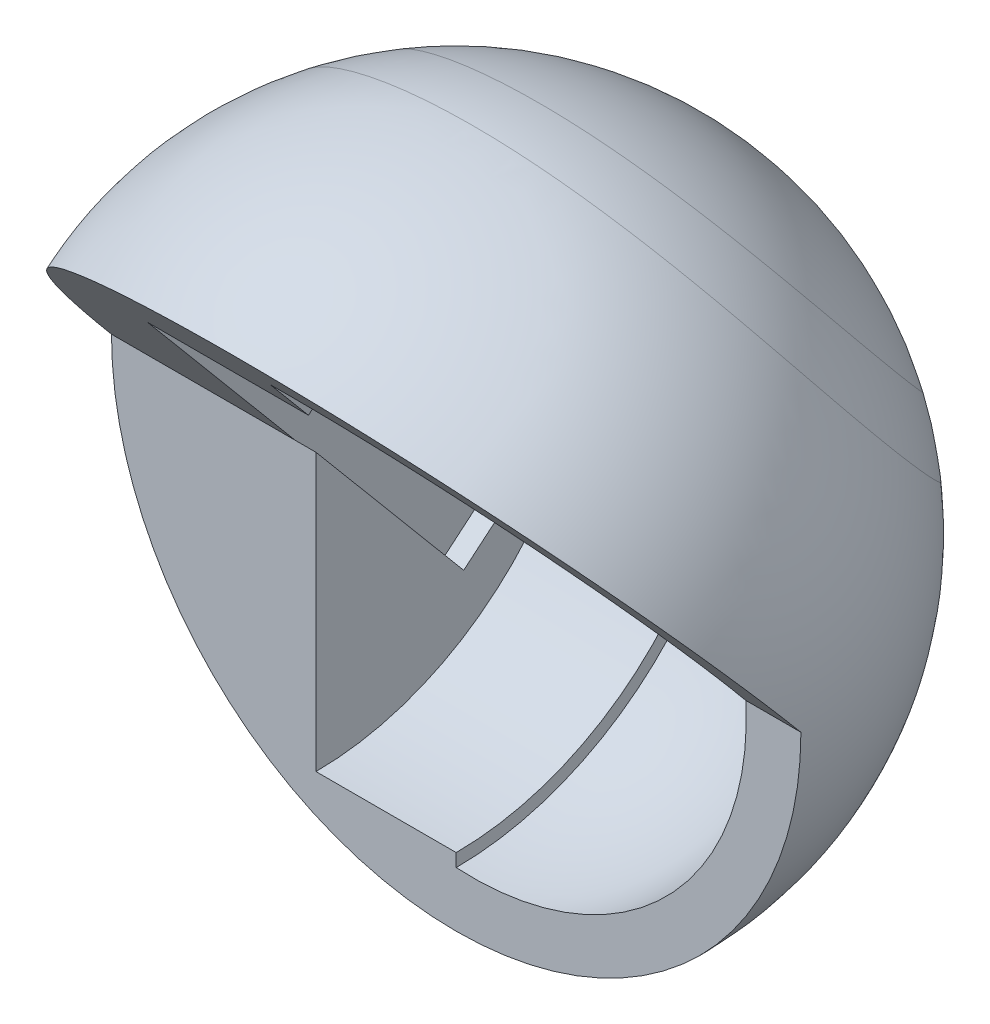
ISO-10303-21;
HEADER;
FILE_DESCRIPTION(('STEP AP214'),'2;1');
FILE_NAME('part.step','',(''),(''),'','','');
FILE_SCHEMA(('AUTOMOTIVE_DESIGN { 1 0 10303 214 1 1 1 1 }'));
ENDSEC;
DATA;
#1=APPLICATION_CONTEXT('core data for automotive mechanical design processes');
#2=APPLICATION_PROTOCOL_DEFINITION('international standard','automotive_design',2000,#1);
#3=PRODUCT_CONTEXT('',#1,'mechanical');
#4=PRODUCT('Part','Part','',(#3));
#5=PRODUCT_RELATED_PRODUCT_CATEGORY('part','',(#4));
#6=PRODUCT_DEFINITION_FORMATION('','',#4);
#7=PRODUCT_DEFINITION_CONTEXT('part definition',#1,'design');
#8=PRODUCT_DEFINITION('design','',#6,#7);
#9=PRODUCT_DEFINITION_SHAPE('','',#8);
#10=(LENGTH_UNIT() NAMED_UNIT(*) SI_UNIT(.MILLI.,.METRE.));
#11=(NAMED_UNIT(*) PLANE_ANGLE_UNIT() SI_UNIT($,.RADIAN.));
#12=(NAMED_UNIT(*) SI_UNIT($,.STERADIAN.) SOLID_ANGLE_UNIT());
#13=UNCERTAINTY_MEASURE_WITH_UNIT(LENGTH_MEASURE(1.E-05),#10,'distance_accuracy_value','');
#14=(GEOMETRIC_REPRESENTATION_CONTEXT(3) GLOBAL_UNCERTAINTY_ASSIGNED_CONTEXT((#13)) GLOBAL_UNIT_ASSIGNED_CONTEXT((#10,
#11,#12)) REPRESENTATION_CONTEXT('',''));
#15=CARTESIAN_POINT('',(0.,0.,0.));
#16=DIRECTION('',(0.,0.,1.));
#17=DIRECTION('',(1.,0.,0.));
#18=AXIS2_PLACEMENT_3D('',#15,#16,#17);
#19=CARTESIAN_POINT('',(0.,0.,0.));
#20=DIRECTION('',(-0.999999999999999,0.,0.));
#21=DIRECTION('',(0.,-0.766044443118972,-0.642787609686545));
#22=AXIS2_PLACEMENT_3D('',#19,#20,#21);
#23=SPHERICAL_SURFACE('',#22,19.05);
#24=CARTESIAN_POINT('',(-15.2400000000001,7.3470623787172,-8.75588798484989));
#25=CARTESIAN_POINT('',(-15.2400009823371,7.48346688099806,-8.64143040361098));
#26=CARTESIAN_POINT('',(-15.2362852653502,7.62036769860385,-8.5275908161164));
#27=CARTESIAN_POINT('',(-15.2214389171233,7.89494066998182,-8.30132013654234));
#28=CARTESIAN_POINT('',(-15.2103078202287,8.03261287165527,-8.18888913336776));
#29=CARTESIAN_POINT('',(-15.1662735878653,8.44222252790344,-7.85738300501019));
#30=CARTESIAN_POINT('',(-15.1227249297518,8.71493771733918,-7.64058544645659));
#31=CARTESIAN_POINT('',(-15.0073648564425,9.26055689290279,-7.21435592759517));
#32=CARTESIAN_POINT('',(-14.9355234635594,9.53346077178956,-7.00493203733236));
#33=CARTESIAN_POINT('',(-14.7633034251425,10.0804607110342,-6.59226558607879));
#34=CARTESIAN_POINT('',(-14.6625888106056,10.3545310007404,-6.38912897947399));
#35=CARTESIAN_POINT('',(-14.4339890068772,10.8985268297894,-5.99257898890046));
#36=CARTESIAN_POINT('',(-14.3060916084978,11.1684504480372,-5.79917002255015));
#37=CARTESIAN_POINT('',(-14.0243586520837,11.7021193733284,-5.42280057501847));
#38=CARTESIAN_POINT('',(-13.8705141429511,11.9658625123796,-5.23984372881265));
#39=CARTESIAN_POINT('',(-13.538389405079,12.4850917033847,-4.88501894909785));
#40=CARTESIAN_POINT('',(-13.3601181799637,12.7405807550912,-4.71314696390936));
#41=CARTESIAN_POINT('',(-12.9741946824924,13.2501333560735,-4.37513613867709));
#42=CARTESIAN_POINT('',(-12.7657537276571,13.5038576321785,-4.20938669933588));
#43=CARTESIAN_POINT('',(-12.3263207118825,13.9987045790177,-3.89042023042541));
#44=CARTESIAN_POINT('',(-12.0953547359423,14.2398413411026,-3.73718907345061));
#45=CARTESIAN_POINT('',(-11.6124905851727,14.7082225549282,-3.4431776933567));
#46=CARTESIAN_POINT('',(-11.3605963077393,14.9354695796803,-3.30239516201406));
#47=CARTESIAN_POINT('',(-10.8373942729328,15.3749255950744,-3.03315206341932));
#48=CARTESIAN_POINT('',(-10.5660693447771,15.5871209466884,-2.90470263543211));
#49=CARTESIAN_POINT('',(-10.0033110780108,15.9969747960668,-2.65906385091892));
#50=CARTESIAN_POINT('',(-9.71170997024377,16.194474516556,-2.54199418377864));
#51=CARTESIAN_POINT('',(-9.11247712461839,16.5716193545238,-2.32042010031508));
#52=CARTESIAN_POINT('',(-8.80483977802566,16.7512581603427,-2.21592012313029));
#53=CARTESIAN_POINT('',(-8.17541000621676,17.0916565322275,-2.01943610469743));
#54=CARTESIAN_POINT('',(-7.85361613128534,17.2524141585297,-1.92745334925615));
#55=CARTESIAN_POINT('',(-7.19769453470059,17.5542058975139,-1.75592112451796));
#56=CARTESIAN_POINT('',(-6.86356599783699,17.6952387036021,-1.67637247882908));
#57=CARTESIAN_POINT('',(-6.13271408442841,17.9769288856262,-1.51837125865418));
#58=CARTESIAN_POINT('',(-5.73424548336606,18.1142162314526,-1.44195505407816));
#59=CARTESIAN_POINT('',(-4.92633051876324,18.3606205160348,-1.3054807724149));
#60=CARTESIAN_POINT('',(-4.51689293408798,18.4697592809881,-1.24541001918757));
#61=CARTESIAN_POINT('',(-3.68933910641371,18.6593497637918,-1.14143250625356));
#62=CARTESIAN_POINT('',(-3.2712213514269,18.7397964386755,-1.09752858801115));
#63=CARTESIAN_POINT('',(-2.42897149108954,18.8714945098042,-1.02581659242403));
#64=CARTESIAN_POINT('',(-2.00483824037516,18.9227402675215,-0.998011623676347));
#65=CARTESIAN_POINT('',(-1.15335913799089,18.9956984401272,-0.958463599147316));
#66=CARTESIAN_POINT('',(-0.726013758307654,19.0174151118641,-0.946718228248));
#67=CARTESIAN_POINT('',(0.12929435556347,19.0311986444346,-0.939260875583965));
#68=CARTESIAN_POINT('',(0.55725709004752,19.0232654910395,-0.94354890151354));
#69=CARTESIAN_POINT('',(1.41114947893952,18.9777966128016,-0.968166181649348));
#70=CARTESIAN_POINT('',(1.83707911280691,18.9402605895133,-0.988495597579151));
#71=CARTESIAN_POINT('',(2.68424729188413,18.8358106349405,-1.04523260138003));
#72=CARTESIAN_POINT('',(3.10548578684639,18.7688963892907,-1.08164036129939));
#73=CARTESIAN_POINT('',(3.940632388045,18.6060902067353,-1.17060199094585));
#74=CARTESIAN_POINT('',(4.35453993382939,18.5101960643494,-1.22315708955192));
#75=CARTESIAN_POINT('',(5.17231107528763,18.2900244312532,-1.34450358217195));
#76=CARTESIAN_POINT('',(5.57617468216928,18.1657469722169,-1.41329495806733));
#77=CARTESIAN_POINT('',(6.3712223008552,17.8895731861756,-1.56724083439981));
#78=CARTESIAN_POINT('',(6.76240429180946,17.7376724825741,-1.65239792792484));
#79=CARTESIAN_POINT('',(7.52929850043405,17.4072555184688,-1.83920157655987));
#80=CARTESIAN_POINT('',(7.9050107576434,17.2287393259967,-1.94084808952136));
#81=CARTESIAN_POINT('',(8.63375295787885,16.84862869148,-2.15943369094363));
#82=CARTESIAN_POINT('',(8.98700304226827,16.6473410331733,-2.2761719498638));
#83=CARTESIAN_POINT('',(9.67303247475743,16.2213699824111,-2.52600575180297));
#84=CARTESIAN_POINT('',(10.0058124523812,15.9966873100032,-2.65910079141865));
#85=CARTESIAN_POINT('',(10.6356161217906,15.5347915322338,-2.93621339302771));
#86=CARTESIAN_POINT('',(10.9335294232033,15.2984127811561,-3.07959975739915));
#87=CARTESIAN_POINT('',(11.505527242837,14.8072616926467,-3.38159985404193));
#88=CARTESIAN_POINT('',(11.7796133144319,14.5524905562593,-3.540212592236));
#89=CARTESIAN_POINT('',(12.2900511796257,14.0380680346104,-3.86529405561679));
#90=CARTESIAN_POINT('',(12.5275329024099,13.7791251219772,-4.03110963980799));
#91=CARTESIAN_POINT('',(12.9764149395347,13.248115032024,-4.37644256957932));
#92=CARTESIAN_POINT('',(13.1878178790104,12.9760491795231,-4.55595853310635));
#93=CARTESIAN_POINT('',(13.5739199791342,12.4330249480387,-4.9202550648194));
#94=CARTESIAN_POINT('',(13.7498178142956,12.1625357893677,-5.10446454775362));
#95=CARTESIAN_POINT('',(14.0742041093613,11.6136040394901,-5.48463262106161));
#96=CARTESIAN_POINT('',(14.2227003641277,11.3351637362333,-5.68058784907234));
#97=CARTESIAN_POINT('',(14.4858575347269,10.78287038788,-6.07617432881739));
#98=CARTESIAN_POINT('',(14.6015653973507,10.5092276306792,-6.27540263144341));
#99=CARTESIAN_POINT('',(14.8051104082635,9.95837434529365,-6.68355903646118));
#100=CARTESIAN_POINT('',(14.8929214595075,9.68116072734942,-6.89249601299732));
#101=CARTESIAN_POINT('',(15.0388821888958,9.12819676470708,-7.31683938204555));
#102=CARTESIAN_POINT('',(15.0973032087155,8.85245719783695,-7.53216639502313));
#103=CARTESIAN_POINT('',(15.1850896840793,8.30184097775901,-7.96998619177496));
#104=CARTESIAN_POINT('',(15.2144428773942,8.02696473744336,-8.19248195884903));
#105=CARTESIAN_POINT('',(15.2437156056609,7.48027247165054,-8.64308087587904));
#106=CARTESIAN_POINT('',(15.2436361940252,7.20845633699835,-8.87118382485798));
#107=CARTESIAN_POINT('',(15.2140534716005,6.66995194980653,-9.33125897007365));
#108=CARTESIAN_POINT('',(15.1845630651869,6.40326150062692,-9.56322942551141));
#109=CARTESIAN_POINT('',(15.0972231464344,5.88092427304449,-10.025599944028));
#110=CARTESIAN_POINT('',(15.0398376536789,5.62516883767009,-10.2559652028594));
#111=CARTESIAN_POINT('',(14.8976204245087,5.12203540524268,-10.7167838997895));
#112=CARTESIAN_POINT('',(14.8128187161899,4.87464856830495,-10.9472369671435));
#113=CARTESIAN_POINT('',(14.616636467233,4.38929757634022,-11.4066546277836));
#114=CARTESIAN_POINT('',(14.5052597026754,4.1513320882187,-11.6356194277955));
#115=CARTESIAN_POINT('',(14.2568937081614,3.68566232280015,-12.0905275387242));
#116=CARTESIAN_POINT('',(14.1198815396054,3.45796746392088,-12.3164679478664));
#117=CARTESIAN_POINT('',(13.8199739465633,3.01158226379071,-12.7657850508065));
#118=CARTESIAN_POINT('',(13.6568186141091,2.79301352064619,-12.9891088812396));
#119=CARTESIAN_POINT('',(13.307041759511,2.36811697893804,-13.4291228110456));
#120=CARTESIAN_POINT('',(13.1204108804009,2.16179410991166,-13.6458102221884));
#121=CARTESIAN_POINT('',(12.7251899398673,1.76198104476435,-14.0709519765368));
#122=CARTESIAN_POINT('',(12.516594889756,1.568493780311,-14.2794044345016));
#123=CARTESIAN_POINT('',(12.0790237683722,1.19479811135645,-14.6866060045085));
#124=CARTESIAN_POINT('',(11.8500461607788,1.01459070968997,-14.8853543833611));
#125=CARTESIAN_POINT('',(11.3505325077107,0.651203262945166,-15.2902882400988));
#126=CARTESIAN_POINT('',(11.0781157852458,0.469380256002162,-15.4953738602034));
#127=CARTESIAN_POINT('',(10.5131229497405,0.12250131619375,-15.8905797852497));
#128=CARTESIAN_POINT('',(10.2205689226722,-0.0425725099422693,-16.0807160107784));
#129=CARTESIAN_POINT('',(9.61716071926929,-0.35597230967425,-16.4448991976471));
#130=CARTESIAN_POINT('',(9.30631008891418,-0.504301512314102,-16.6189492598754));
#131=CARTESIAN_POINT('',(8.66801570097351,-0.78425939075362,-16.949983152925));
#132=CARTESIAN_POINT('',(8.34055682533803,-0.915872454157191,-17.1069510101532));
#133=CARTESIAN_POINT('',(7.66797034527359,-1.1634051722562,-17.4041150049212));
#134=CARTESIAN_POINT('',(7.32269786392683,-1.27915318499559,-17.5441260480188));
#135=CARTESIAN_POINT('',(6.6195242097018,-1.49335948982947,-17.8046733253849));
#136=CARTESIAN_POINT('',(6.26161851735144,-1.59181151751652,-17.9252025022866));
#137=CARTESIAN_POINT('',(5.53527715873363,-1.77136471510366,-18.1460089833337));
#138=CARTESIAN_POINT('',(5.16683929705067,-1.85246223714168,-18.246282029457));
#139=CARTESIAN_POINT('',(4.42167944429324,-1.99723875223198,-18.4259160317876));
#140=CARTESIAN_POINT('',(4.04496003127319,-2.06092308533707,-18.5052833988052));
#141=CARTESIAN_POINT('',(3.23576548018926,-2.17804331953676,-18.6516104018291));
#142=CARTESIAN_POINT('',(2.80240376410725,-2.22907376965084,-18.7156195583821));
#143=CARTESIAN_POINT('',(1.93081908676633,-2.30888289830996,-18.815881221772));
#144=CARTESIAN_POINT('',(1.49260023499995,-2.3376791185006,-18.852155609671));
#145=CARTESIAN_POINT('',(0.613734149021598,-2.37309005133867,-18.8967782732896));
#146=CARTESIAN_POINT('',(0.173086313089596,-2.37969899520872,-18.9051192862226));
#147=CARTESIAN_POINT('',(-0.707708186890462,-2.37071677203881,-18.8937924639692));
#148=CARTESIAN_POINT('',(-1.14785473648696,-2.35512127680121,-18.8741191680971));
#149=CARTESIAN_POINT('',(-2.02463582285046,-2.30172608788509,-18.8068982846431));
#150=CARTESIAN_POINT('',(-2.46127055949341,-2.26392766708924,-18.7593522949893));
#151=CARTESIAN_POINT('',(-3.32814079266305,-2.16613355727783,-18.6367340476515));
#152=CARTESIAN_POINT('',(-3.75837637930115,-2.10613818114333,-18.5616621779635));
#153=CARTESIAN_POINT('',(-4.6095838501107,-1.96395296301017,-18.3845365396287));
#154=CARTESIAN_POINT('',(-5.0305546768406,-1.88176060160146,-18.2824797081528));
#155=CARTESIAN_POINT('',(-5.86024939335907,-1.69520274485022,-18.052155557976));
#156=CARTESIAN_POINT('',(-6.26897323133377,-1.59083715571355,-17.9238881284026));
#157=CARTESIAN_POINT('',(-7.06354147666385,-1.3621761755786,-17.6448317567412));
#158=CARTESIAN_POINT('',(-7.44967371722572,-1.23829932864744,-17.4945195523637));
#159=CARTESIAN_POINT('',(-8.20446464017777,-0.969309654280089,-17.1708005077139));
#160=CARTESIAN_POINT('',(-8.57312418408478,-0.824197875308349,-16.9973948077097));
#161=CARTESIAN_POINT('',(-9.27823048565946,-0.518004067995728,-16.6349978330115));
#162=CARTESIAN_POINT('',(-9.61534001286067,-0.357611064762983,-16.4467139327214));
#163=CARTESIAN_POINT('',(-10.2679768711361,-0.0172063777875996,-16.0513355714352));
#164=CARTESIAN_POINT('',(-10.5835037396992,0.162805726173284,-15.8442407075461));
#165=CARTESIAN_POINT('',(-11.1779550051694,0.534469141368833,-15.4217633456833));
#166=CARTESIAN_POINT('',(-11.4578468891608,0.725347503036654,-15.2070622050089));
#167=CARTESIAN_POINT('',(-11.992924210939,1.12455497678003,-14.7637435175171));
#168=CARTESIAN_POINT('',(-12.2481179512217,1.33287818038781,-14.5351306896208));
#169=CARTESIAN_POINT('',(-12.7206831221444,1.75677758620682,-14.0764635467003));
#170=CARTESIAN_POINT('',(-12.9392406970778,1.97160395772659,-13.8469383871358));
#171=CARTESIAN_POINT('',(-13.3500725990209,2.41646692079059,-13.3785430691593));
#172=CARTESIAN_POINT('',(-13.5423176099219,2.64652006076332,-13.1396628627141));
#173=CARTESIAN_POINT('',(-13.893261513289,3.11406033793572,-12.6617872989895));
#174=CARTESIAN_POINT('',(-14.0527607699284,3.35114833531839,-12.4229895281442));
#175=CARTESIAN_POINT('',(-14.3433567558089,3.8378863587334,-11.9406778815769));
#176=CARTESIAN_POINT('',(-14.4744413105113,4.08754171313664,-11.6971620328388));
#177=CARTESIAN_POINT('',(-14.70663632205,4.59796181563672,-11.2077880147924));
#178=CARTESIAN_POINT('',(-14.8077630394081,4.85872044885729,-10.9619311911952));
#179=CARTESIAN_POINT('',(-14.9789277856846,5.3898572822636,-10.4700473522318));
#180=CARTESIAN_POINT('',(-15.0489830165727,5.6602300700199,-10.2240205067504));
#181=CARTESIAN_POINT('',(-15.1486338330843,6.16527974041979,-9.77284751555507));
#182=CARTESIAN_POINT('',(-15.1828907766874,6.39879880028677,-9.56741978916015));
#183=CARTESIAN_POINT('',(-15.2285610028949,6.87006014542048,-9.15932533983209));
#184=CARTESIAN_POINT('',(-15.2399982769009,7.10779772987674,-8.9566559398978));
#185=CARTESIAN_POINT('',(-15.2400000000001,7.3470623787172,-8.75588798484989));
#186=B_SPLINE_CURVE_WITH_KNOTS('',3,(#24,#25,#26,#27,#28,#29,#30,#31,#32,#33,#34,#35,#36,#37,
#38,#39,#40,#41,#42,#43,#44,#45,#46,#47,#48,#49,#50,#51,#52,#53,#54,#55,#56,#57,#58,#59,#60,#61,
#62,#63,#64,#65,#66,#67,#68,#69,#70,#71,#72,#73,#74,#75,#76,#77,#78,#79,#80,#81,#82,#83,#84,#85,
#86,#87,#88,#89,#90,#91,#92,#93,#94,#95,#96,#97,#98,#99,#100,#101,#102,#103,#104,#105,#106,#107,
#108,#109,#110,#111,#112,#113,#114,#115,#116,#117,#118,#119,#120,#121,#122,#123,#124,#125,#126,
#127,#128,#129,#130,#131,#132,#133,#134,#135,#136,#137,#138,#139,#140,#141,#142,#143,#144,#145,
#146,#147,#148,#149,#150,#151,#152,#153,#154,#155,#156,#157,#158,#159,#160,#161,#162,#163,#164,
#165,#166,#167,#168,#169,#170,#171,#172,#173,#174,#175,#176,#177,#178,#179,#180,#181,#182,#183,
#184,#185),.UNSPECIFIED.,.T.,.F.,(4,2,2,2,2,2,2,2,2,2,2,2,2,2,2,2,2,2,2,2,2,2,2,2,2,2,2,2,2,2,2,
2,2,2,2,2,2,2,2,2,2,2,2,2,2,2,2,2,2,2,2,2,2,2,2,2,2,2,2,2,2,2,2,2,2,2,2,2,2,2,2,2,2,2,2,2,2,2,2,
2,4),(0.,0.534115971263539,1.06826548591727,2.12023334155938,3.17331882604921,4.23919327706738,
5.30554748274369,6.37227030895215,7.4386009963471,8.54092859424014,9.64199447166884,
10.7428557595263,11.8447021726132,12.9571066251538,14.0699027904873,15.1828131794518,
16.2957972539374,17.5793527912264,18.8619100566155,20.1446926353184,21.4277228280279,
22.7105680422862,23.9934138721714,25.2762726354158,26.5591451263803,27.8421152734189,
29.1250839887585,30.4082561536336,31.6914250386516,32.9590020176744,34.2265399949686,
35.4444786211776,36.6623377863948,37.8265886349648,38.9907221922527,40.1040830655596,
41.2171267338624,42.2890690767121,43.3620112725508,44.4248569422601,45.4881507814343,
46.5514065646122,47.614196038566,48.6598820803411,49.7044266741286,50.7488229356607,
51.7941582330595,52.8506168637205,53.9074979236861,54.9646195513124,56.0218209263158,
57.1798972136865,58.3367229972801,59.4933253153888,60.6510000453198,61.820349163324,
62.9901209369042,64.1601383518083,65.3297965573704,66.6513745737911,67.9719088658104,
69.2927864752573,70.6139215918673,71.9349809758494,73.256021739317,74.5772125070825,
75.8984088636789,77.1943807976275,78.4902887651681,79.7432300542142,80.9961981850766,
82.198120698879,83.3996377622945,84.547013063835,85.6956564832316,86.8115406369792,
87.9279019605804,89.0436562304087,90.1587920167254,91.0966616448382,92.0335447254371),.UNSPECIFIED.);
#187=CARTESIAN_POINT('',(-15.2400000000001,7.3470623787172,-8.75588798484989));
#188=VERTEX_POINT('',#187);
#189=EDGE_CURVE('E88',#188,#188,#186,.T.);
#190=ORIENTED_EDGE('',*,*,#189,.T.);
#191=EDGE_LOOP('',(#190));
#192=FACE_BOUND('',#191,.T.);
#193=CARTESIAN_POINT('',(12.6910308678337,8.76139263190298,-11.1838381006399));
#194=CARTESIAN_POINT('',(12.685614563726,8.65102665048384,-11.2764456022149));
#195=CARTESIAN_POINT('',(12.6771672804842,8.54109343478938,-11.3693638402291));
#196=CARTESIAN_POINT('',(12.6542366139661,8.32225969781947,-11.5556726452633));
#197=CARTESIAN_POINT('',(12.6397531794218,8.2133591853233,-11.6490632162884));
#198=CARTESIAN_POINT('',(12.5878182334163,7.89175907920314,-11.9268633274492));
#199=CARTESIAN_POINT('',(12.5417127558939,7.6807886515358,-12.1117322082348));
#200=CARTESIAN_POINT('',(12.4266089690716,7.26477713272285,-12.481416711351));
#201=CARTESIAN_POINT('',(12.3575861595609,7.05974264365163,-12.6662320639018));
#202=CARTESIAN_POINT('',(12.1964026120949,6.65457414479524,-13.0364752247857));
#203=CARTESIAN_POINT('',(12.103971896197,6.45452950258099,-13.2218833643993));
#204=CARTESIAN_POINT('',(11.8973115573905,6.06295810132286,-13.5896980268755));
#205=CARTESIAN_POINT('',(11.7830721795156,5.87143520148707,-13.7721031666918));
#206=CARTESIAN_POINT('',(11.5338999430874,5.49782511537923,-14.1325332023913));
#207=CARTESIAN_POINT('',(11.3989597691543,5.31574129530265,-14.3105565238902));
#208=CARTESIAN_POINT('',(11.1097180147225,4.96186383369878,-14.6608130889335));
#209=CARTESIAN_POINT('',(10.955423472084,4.79006648506398,-14.8330484084585));
#210=CARTESIAN_POINT('',(10.6230205709567,4.45139252361761,-15.1765548877097));
#211=CARTESIAN_POINT('',(10.4442662823031,4.28490049094384,-15.3475798512114));
#212=CARTESIAN_POINT('',(10.0691288155185,3.96408985978983,-15.6808712840861));
#213=CARTESIAN_POINT('',(9.87276579608102,3.80975771151344,-15.8431474367241));
#214=CARTESIAN_POINT('',(9.46381613203356,3.51340091656587,-16.1580704627397));
#215=CARTESIAN_POINT('',(9.25123292849987,3.37137367301409,-16.3107193660348));
#216=CARTESIAN_POINT('',(8.81115049023564,3.09968129049982,-16.60562540311));
#217=CARTESIAN_POINT('',(8.58363887141991,2.97002663991627,-16.7478736967172));
#218=CARTESIAN_POINT('',(8.11326192800392,2.72222546911048,-17.0222577330379));
#219=CARTESIAN_POINT('',(7.87027700044321,2.6041928373451,-17.1542911116507));
#220=CARTESIAN_POINT('',(7.37225202787596,2.38099384885817,-17.4061374525046));
#221=CARTESIAN_POINT('',(7.11720792020672,2.27583187161679,-17.5259462528114));
#222=CARTESIAN_POINT('',(6.59656924779821,2.07841375924914,-17.752699707231));
#223=CARTESIAN_POINT('',(6.33097282649971,1.98615990818623,-17.8596420841916));
#224=CARTESIAN_POINT('',(5.79070098217935,1.81455527689222,-18.0601238972523));
#225=CARTESIAN_POINT('',(5.51602484797552,1.73520551028793,-18.1536622803887));
#226=CARTESIAN_POINT('',(4.90755217087944,1.57590522574462,-18.3428945362137));
#227=CARTESIAN_POINT('',(4.57220263395847,1.49854812970066,-18.4357984446567));
#228=CARTESIAN_POINT('',(3.89328138793382,1.361862367462,-18.6015291061587));
#229=CARTESIAN_POINT('',(3.54971609514749,1.30252009815472,-18.6743710042975));
#230=CARTESIAN_POINT('',(2.85626777488725,1.20167770086508,-18.7996515185187));
#231=CARTESIAN_POINT('',(2.50638404851501,1.16017955942082,-18.8520878628448));
#232=CARTESIAN_POINT('',(1.80243334472987,1.09493564408081,-18.9362509217114));
#233=CARTESIAN_POINT('',(1.44836558905177,1.07119322743049,-18.9679737195989));
#234=CARTESIAN_POINT('',(0.738351287225338,1.04139222461739,-19.0105103473525));
#235=CARTESIAN_POINT('',(0.38240537269456,1.03532803119307,-19.0213308067526));
#236=CARTESIAN_POINT('',(-0.329475576287558,1.04079513067672,-19.0220248689176));
#237=CARTESIAN_POINT('',(-0.685410576766383,1.05233159775974,-19.0118923116832));
#238=CARTESIAN_POINT('',(-1.39501654075425,1.09294728959255,-18.9707300504787));
#239=CARTESIAN_POINT('',(-1.74868780752892,1.12202411260554,-18.9397032074192));
#240=CARTESIAN_POINT('',(-2.45171442000383,1.19767270217863,-18.8569319313845));
#241=CARTESIAN_POINT('',(-2.80106973585861,1.24424458964997,-18.8051873552256));
#242=CARTESIAN_POINT('',(-3.49343223154204,1.35486264930344,-18.6812620171939));
#243=CARTESIAN_POINT('',(-3.83643772522452,1.41891339375498,-18.609075907863));
#244=CARTESIAN_POINT('',(-4.51374624552199,1.56443141711092,-18.4447239163068));
#245=CARTESIAN_POINT('',(-4.8480520384666,1.64589308186894,-18.3525644743433));
#246=CARTESIAN_POINT('',(-5.50600863727718,1.82624827168678,-18.1487733362173));
#247=CARTESIAN_POINT('',(-5.82965542520938,1.92514828289601,-18.0371343948651));
#248=CARTESIAN_POINT('',(-6.46391696970194,2.14031561472677,-17.7951147819355));
#249=CARTESIAN_POINT('',(-6.77453188573393,2.25658272274686,-17.6647343397853));
#250=CARTESIAN_POINT('',(-7.37779777712614,2.50532683471915,-17.3873097087688));
#251=CARTESIAN_POINT('',(-7.67058120520752,2.63765448103509,-17.240419876305));
#252=CARTESIAN_POINT('',(-8.2387852937536,2.91919241027799,-16.9300865616696));
#253=CARTESIAN_POINT('',(-8.51420545359131,3.06840317964182,-16.7666426025544));
#254=CARTESIAN_POINT('',(-9.03230924201787,3.37579292027978,-16.43279195641));
#255=CARTESIAN_POINT('',(-9.27593489154215,3.5331773954635,-16.2631157543182));
#256=CARTESIAN_POINT('',(-9.74316176735061,3.86270641138165,-15.9111731270409));
#257=CARTESIAN_POINT('',(-9.96677015312059,4.03484563138273,-15.7289112449691));
#258=CARTESIAN_POINT('',(-10.3808956045313,4.38419898416711,-15.3629283371939));
#259=CARTESIAN_POINT('',(-10.5725281721798,4.56068517833977,-15.1797747604352));
#260=CARTESIAN_POINT('',(-10.9344084466314,4.92632435891214,-14.8045265890336));
#261=CARTESIAN_POINT('',(-11.1046315958454,5.11549151663748,-14.6124220670781));
#262=CARTESIAN_POINT('',(-11.4161451822904,5.49882763705529,-14.2278443201144));
#263=CARTESIAN_POINT('',(-11.5582378665958,5.69259181188666,-14.0356178098726));
#264=CARTESIAN_POINT('',(-11.8191946930421,6.09042198558707,-13.6458964691759));
#265=CARTESIAN_POINT('',(-11.9380493479126,6.29449214942378,-13.4483995242292));
#266=CARTESIAN_POINT('',(-12.1510163420265,6.71171162307927,-13.0500075535985));
#267=CARTESIAN_POINT('',(-12.2451464739445,6.92485427493182,-12.8491150828837));
#268=CARTESIAN_POINT('',(-12.4075699487307,7.35903391566559,-12.4456296517383));
#269=CARTESIAN_POINT('',(-12.4758761020449,7.58006693067628,-12.2430375855429));
#270=CARTESIAN_POINT('',(-12.5839762802433,8.0212137864102,-11.8445929006257));
#271=CARTESIAN_POINT('',(-12.6246428372738,8.24111381202458,-11.6487401792526));
#272=CARTESIAN_POINT('',(-12.6804907999664,8.68555940635431,-11.2586373519938));
#273=CARTESIAN_POINT('',(-12.6956709370022,8.91010520575711,-11.0643873263637));
#274=CARTESIAN_POINT('',(-12.7002074064104,9.35336088812511,-10.6865966236742));
#275=CARTESIAN_POINT('',(-12.690547326906,9.57195705148406,-10.5029336550189));
#276=CARTESIAN_POINT('',(-12.6475182834848,10.0104415211591,-10.1397913900938));
#277=CARTESIAN_POINT('',(-12.614139655148,10.2303303179429,-9.96031383001976));
#278=CARTESIAN_POINT('',(-12.5239878977918,10.6697641870765,-9.60676548249933));
#279=CARTESIAN_POINT('',(-12.4672076298486,10.889309133998,-9.43269636239708));
#280=CARTESIAN_POINT('',(-12.3308774659594,11.3262799974874,-9.09114166173042));
#281=CARTESIAN_POINT('',(-12.2513368246126,11.5437067382582,-8.92365343672411));
#282=CARTESIAN_POINT('',(-12.0709463701479,11.9734106883675,-8.59724072526829));
#283=CARTESIAN_POINT('',(-11.9702524007787,12.1857135482992,-8.43826373088975));
#284=CARTESIAN_POINT('',(-11.7483366843489,12.6050413587357,-8.12848015712008));
#285=CARTESIAN_POINT('',(-11.627138380655,12.8120720295525,-7.97766450360442));
#286=CARTESIAN_POINT('',(-11.3652818852116,13.219691904807,-7.68457916661828));
#287=CARTESIAN_POINT('',(-11.2246270553472,13.4202822147103,-7.54230801282497));
#288=CARTESIAN_POINT('',(-10.9249378747443,13.8139605278078,-7.26656755927814));
#289=CARTESIAN_POINT('',(-10.7658881496085,14.0070420724708,-7.13310577083324));
#290=CARTESIAN_POINT('',(-10.4291907160968,14.3861817239953,-6.87415954523723));
#291=CARTESIAN_POINT('',(-10.2513800281779,14.5721552338539,-6.74876337897839));
#292=CARTESIAN_POINT('',(-9.87972340726728,14.9341242209577,-6.50748598582053));
#293=CARTESIAN_POINT('',(-9.68587163504842,15.1101160250531,-6.3916082546512));
#294=CARTESIAN_POINT('',(-9.28349586922039,15.4511718593102,-6.16947367893175));
#295=CARTESIAN_POINT('',(-9.0749678574416,15.616232872562,-6.06321948753817));
#296=CARTESIAN_POINT('',(-8.64463164170789,15.9345759203369,-5.86038139930307));
#297=CARTESIAN_POINT('',(-8.42282230267518,16.0878569455293,-5.7637983308866));
#298=CARTESIAN_POINT('',(-7.93318561792172,16.4039261678174,-5.56655299350705));
#299=CARTESIAN_POINT('',(-7.66343628148223,16.5647094473818,-5.46743979273355));
#300=CARTESIAN_POINT('',(-7.1104277336135,16.8687060914538,-5.28196333259377));
#301=CARTESIAN_POINT('',(-6.8271824141731,17.0119370030111,-5.19558732203454));
#302=CARTESIAN_POINT('',(-6.24890252040256,17.2802486244767,-5.03534653961046));
#303=CARTESIAN_POINT('',(-5.95387075997812,17.4053336339169,-4.96147880331023));
#304=CARTESIAN_POINT('',(-5.35354436191368,17.6368867745988,-4.82602098966211));
#305=CARTESIAN_POINT('',(-5.04824072161805,17.7433380395695,-4.76444202846995));
#306=CARTESIAN_POINT('',(-4.42637507654545,17.9379521683643,-4.65294588325362));
#307=CARTESIAN_POINT('',(-4.10973171153107,18.0259242259886,-4.60314975529447));
#308=CARTESIAN_POINT('',(-3.46978239305633,18.1818769041708,-4.515847079553));
#309=CARTESIAN_POINT('',(-3.14647411276439,18.2498504119542,-4.47834490375276));
#310=CARTESIAN_POINT('',(-2.49506602933412,18.3654763896236,-4.41552197396624));
#311=CARTESIAN_POINT('',(-2.16696605532086,18.4131281329832,-4.39020165549123));
#312=CARTESIAN_POINT('',(-1.50772746974568,18.4879145575829,-4.3516331547094));
#313=CARTESIAN_POINT('',(-1.1765886990649,18.5150481581665,-4.33838560824798));
#314=CARTESIAN_POINT('',(-0.466185235589602,18.5510602495198,-4.32285503447111));
#315=CARTESIAN_POINT('',(-0.0867181797778129,18.5568253140407,-4.32238138600547));
#316=CARTESIAN_POINT('',(0.671066955820885,18.5414839772638,-4.33694793535809));
#317=CARTESIAN_POINT('',(1.04938569805824,18.5203983936474,-4.35197611267971));
#318=CARTESIAN_POINT('',(1.80277695786621,18.4515099731759,-4.3974901516522));
#319=CARTESIAN_POINT('',(2.17784837031224,18.4036983779144,-4.42798108031184));
#320=CARTESIAN_POINT('',(2.92214145044834,18.2816141645702,-4.50442886847399));
#321=CARTESIAN_POINT('',(3.2913619966207,18.2073365359494,-4.55038865644302));
#322=CARTESIAN_POINT('',(4.01759948785477,18.033637923278,-4.6572639752624));
#323=CARTESIAN_POINT('',(4.37470221728851,17.9344795468076,-4.71802311932099));
#324=CARTESIAN_POINT('',(5.0780246652666,17.7112371321348,-4.85479448755885));
#325=CARTESIAN_POINT('',(5.42424498624031,17.5871544765134,-4.93080586567738));
#326=CARTESIAN_POINT('',(6.09223047795618,17.3192187079315,-5.0954621631183));
#327=CARTESIAN_POINT('',(6.41442441865237,17.1761346627842,-5.18361906818158));
#328=CARTESIAN_POINT('',(7.04377807564238,16.8681801911612,-5.37438319312674));
#329=CARTESIAN_POINT('',(7.35093856021114,16.7033108796037,-5.47698967353128));
#330=CARTESIAN_POINT('',(7.93491877584523,16.360361295917,-5.69200266568048));
#331=CARTESIAN_POINT('',(8.21247502899975,16.1831526139466,-5.8037989573397));
#332=CARTESIAN_POINT('',(8.74931939636727,15.8108257674215,-6.04073046361843));
#333=CARTESIAN_POINT('',(9.00860739682925,15.6157074913666,-6.1658657612838));
#334=CARTESIAN_POINT('',(9.49420880135653,15.2190079849923,-6.4228757109698));
#335=CARTESIAN_POINT('',(9.72152099818143,15.0182314351855,-6.55410520031086));
#336=CARTESIAN_POINT('',(10.1555043677288,14.6030730887447,-6.82842747953966));
#337=CARTESIAN_POINT('',(10.3621825973179,14.3886959848394,-6.97151618269491));
#338=CARTESIAN_POINT('',(10.7428566734912,13.9592216268464,-7.26165545763392));
#339=CARTESIAN_POINT('',(10.917990257313,13.7447355958354,-7.40811793331771));
#340=CARTESIAN_POINT('',(11.2464726011192,13.306086165576,-7.71139357720564));
#341=CARTESIAN_POINT('',(11.3997976412162,13.0819125699346,-7.86821774789161));
#342=CARTESIAN_POINT('',(11.6781699892244,12.6332647402023,-8.18628850832484));
#343=CARTESIAN_POINT('',(11.8039797648346,12.4090414689204,-8.34722139662323));
#344=CARTESIAN_POINT('',(12.0321855024204,11.954876605991,-8.67766395995192));
#345=CARTESIAN_POINT('',(12.1345717343898,11.7249326818319,-8.84717716361848));
#346=CARTESIAN_POINT('',(12.3146265805196,11.2613161487371,-9.19386123415023));
#347=CARTESIAN_POINT('',(12.3923051375958,11.0276450795433,-9.37102898797047));
#348=CARTESIAN_POINT('',(12.5219869482543,10.5585014047935,-9.73201605402227));
#349=CARTESIAN_POINT('',(12.5740035159899,10.323029797943,-9.91583186381057));
#350=CARTESIAN_POINT('',(12.6495473713259,9.86529072529756,-10.2785851400577));
#351=CARTESIAN_POINT('',(12.6745022752173,9.64301957039501,-10.457222567744));
#352=CARTESIAN_POINT('',(12.7005954112877,9.20039824437765,-10.8181157996524));
#353=CARTESIAN_POINT('',(12.7017614736322,8.98004613004834,-11.0003671260378));
#354=CARTESIAN_POINT('',(12.6910308678337,8.76139263190298,-11.1838381006399));
#355=B_SPLINE_CURVE_WITH_KNOTS('',3,(#193,#194,#195,#196,#197,#198,#199,#200,#201,#202,#203,
#204,#205,#206,#207,#208,#209,#210,#211,#212,#213,#214,#215,#216,#217,#218,#219,#220,#221,#222,
#223,#224,#225,#226,#227,#228,#229,#230,#231,#232,#233,#234,#235,#236,#237,#238,#239,#240,#241,
#242,#243,#244,#245,#246,#247,#248,#249,#250,#251,#252,#253,#254,#255,#256,#257,#258,#259,#260,
#261,#262,#263,#264,#265,#266,#267,#268,#269,#270,#271,#272,#273,#274,#275,#276,#277,#278,#279,
#280,#281,#282,#283,#284,#285,#286,#287,#288,#289,#290,#291,#292,#293,#294,#295,#296,#297,#298,
#299,#300,#301,#302,#303,#304,#305,#306,#307,#308,#309,#310,#311,#312,#313,#314,#315,#316,#317,
#318,#319,#320,#321,#322,#323,#324,#325,#326,#327,#328,#329,#330,#331,#332,#333,#334,#335,#336,
#337,#338,#339,#340,#341,#342,#343,#344,#345,#346,#347,#348,#349,#350,#351,#352,#353,#354),
.UNSPECIFIED.,.T.,.F.,(4,2,2,2,2,2,2,2,2,2,2,2,2,2,2,2,2,2,2,2,2,2,2,2,2,2,2,2,2,2,2,2,2,2,2,2,
2,2,2,2,2,2,2,2,2,2,2,2,2,2,2,2,2,2,2,2,2,2,2,2,2,2,2,2,2,2,2,2,2,2,2,2,2,2,2,2,2,2,2,2,4),(0.,
0.432453847657261,0.864911368434055,1.71665051003618,2.56930316734824,3.43227747510194,
4.29563869764985,5.15930572614447,6.02265960352084,6.91632768744778,7.80898544092239,
8.7014543427672,9.5946732015581,10.4959189780205,11.3974705725562,12.2991814933803,
13.2009632101865,14.2692234448844,15.3366750113209,16.4042453834833,17.4720175604299,
18.5394510195336,19.6071983391262,20.6747994891579,21.7424080176901,22.810296088574,
23.8778403373474,24.9457824973833,26.0137115851465,27.0723771476865,28.1310732202891,
29.1380369550791,30.1446390825145,31.0989601932596,32.0543661600487,32.976438043323,
33.8988855936374,34.8206674867263,35.7419915115654,36.6326807208631,37.5234142642857,
38.3794255128653,39.2357857541053,40.0924074309067,40.9486812903617,41.7988550391189,
42.6480632417331,43.4971248928744,44.3469013865352,45.2047863943591,46.0629850723569,
46.9214196353132,47.7799276686858,48.7667914093165,49.7526603946493,50.7382954030418,
51.7248179935868,52.7210741523895,53.717684216992,54.7143299085645,55.7110280881615,
56.8482611978279,57.9846131314209,59.1213376784832,60.2582775441977,61.3836881246475,
62.5090362943967,63.5979940970492,64.6868961909938,65.7290281669958,66.7711666314724,
67.7614499039528,68.7513933285516,69.6901140945932,70.6298481708741,71.5387635445359,
72.4480557936671,73.3569816591284,74.265435451347,75.1232025148455,75.9799660334661),.UNSPECIFIED.);
#356=CARTESIAN_POINT('',(12.6910308678337,8.76139263190298,-11.1838381006399));
#357=VERTEX_POINT('',#356);
#358=EDGE_CURVE('E12',#357,#357,#355,.T.);
#359=ORIENTED_EDGE('',*,*,#358,.F.);
#360=EDGE_LOOP('',(#359));
#361=FACE_BOUND('',#360,.T.);
#362=ADVANCED_FACE('F78',(#192,#361),#23,.T.);
#363=CARTESIAN_POINT('',(0.,0.,0.));
#364=DIRECTION('',(0.,0.642787609686545,-0.766044443118972));
#365=DIRECTION('',(0.999999999999999,0.,0.));
#366=AXIS2_PLACEMENT_3D('',#363,#364,#365);
#367=CIRCLE('',#366,19.05);
#368=CARTESIAN_POINT('',(-19.05,0.,0.));
#369=VERTEX_POINT('',#368);
#370=CARTESIAN_POINT('',(19.05,0.,0.));
#371=VERTEX_POINT('',#370);
#372=EDGE_CURVE('E255',#369,#371,#367,.T.);
#373=ORIENTED_EDGE('',*,*,#372,.T.);
#374=CARTESIAN_POINT('',(0.,0.,0.));
#375=DIRECTION('',(0.,0.,1.));
#376=DIRECTION('',(0.999999999999999,0.,0.));
#377=AXIS2_PLACEMENT_3D('',#374,#375,#376);
#378=CIRCLE('',#377,19.05);
#379=EDGE_CURVE('E103',#369,#371,#378,.T.);
#380=ORIENTED_EDGE('',*,*,#379,.F.);
#381=EDGE_LOOP('',(#373,#380));
#382=FACE_BOUND('',#381,.T.);
#383=ORIENTED_EDGE('',*,*,#189,.F.);
#384=EDGE_LOOP('',(#383));
#385=FACE_BOUND('',#384,.T.);
#386=ADVANCED_FACE('F334',(#382,#385),#23,.T.);
#387=CARTESIAN_POINT('',(0.,0.,0.));
#388=DIRECTION('',(-0.999999999999999,0.,0.));
#389=DIRECTION('',(0.,-0.999999999999999,0.));
#390=AXIS2_PLACEMENT_3D('',#387,#388,#389);
#391=PLANE('',#390);
#392=DIRECTION('',(0.,-0.766044443118972,-0.642787609686545));
#393=VECTOR('',#392,1.);
#394=CARTESIAN_POINT('',(0.,0.,0.));
#395=LINE('',#394,#393);
#396=CARTESIAN_POINT('',(0.,12.2582431787898,10.2858873302041));
#397=VERTEX_POINT('',#396);
#398=CARTESIAN_POINT('',(-1.38777878078145E-13,9.72876442761092,8.16340264301912));
#399=VERTEX_POINT('',#398);
#400=EDGE_CURVE('E243',#397,#399,#395,.T.);
#401=ORIENTED_EDGE('',*,*,#400,.T.);
#402=DIRECTION('',(0.,0.642787609686545,-0.766044443118972));
#403=VECTOR('',#402,1.);
#404=CARTESIAN_POINT('',(-1.38777878078145E-13,9.72876442761092,8.16340264301912));
#405=LINE('',#404,#403);
#406=CARTESIAN_POINT('',(0.,15.986426567548,0.7058113065085));
#407=VERTEX_POINT('',#406);
#408=EDGE_CURVE('E267',#399,#407,#405,.T.);
#409=ORIENTED_EDGE('',*,*,#408,.T.);
#410=CARTESIAN_POINT('',(0.,0.,0.));
#411=DIRECTION('',(0.999999999999999,0.,0.));
#412=DIRECTION('',(0.,0.999999999999999,0.));
#413=AXIS2_PLACEMENT_3D('',#410,#411,#412);
#414=CIRCLE('',#413,16.002);
#415=EDGE_CURVE('E246',#407,#397,#414,.T.);
#416=ORIENTED_EDGE('',*,*,#415,.T.);
#417=EDGE_LOOP('',(#401,#409,#416));
#418=FACE_BOUND('',#417,.T.);
#419=ADVANCED_FACE('F298',(#418),#391,.F.);
#420=CARTESIAN_POINT('',(0.,-2.93971911955368,-15.7296552885984));
#421=VERTEX_POINT('',#420);
#422=CARTESIAN_POINT('',(-2.77555756156289E-13,16.0011633483842,0.163632204420838));
#423=VERTEX_POINT('',#422);
#424=EDGE_CURVE('E354',#421,#423,#414,.T.);
#425=ORIENTED_EDGE('',*,*,#424,.T.);
#426=DIRECTION('',(0.,-0.766044443118972,-0.642787609686545));
#427=VECTOR('',#426,1.);
#428=CARTESIAN_POINT('',(0.,6.5307221144153,-7.78301154208876));
#429=LINE('',#428,#427);
#430=EDGE_CURVE('E264',#423,#421,#429,.T.);
#431=ORIENTED_EDGE('',*,*,#430,.T.);
#432=EDGE_LOOP('',(#425,#431));
#433=FACE_BOUND('',#432,.T.);
#434=ADVANCED_FACE('F299',(#433),#391,.F.);
#435=ORIENTED_EDGE('',*,*,#358,.T.);
#436=EDGE_LOOP('',(#435));
#437=FACE_BOUND('',#436,.T.);
#438=ADVANCED_FACE('F279',(#437),#23,.T.);
#439=CARTESIAN_POINT('',(0.,0.,0.));
#440=DIRECTION('',(0.,0.642787609686545,-0.766044443118972));
#441=DIRECTION('',(0.999999999999999,0.,0.));
#442=AXIS2_PLACEMENT_3D('',#439,#440,#441);
#443=PLANE('',#442);
#444=DIRECTION('',(-0.999999999999999,0.,0.));
#445=VECTOR('',#444,1.);
#446=CARTESIAN_POINT('',(19.05,0.,0.));
#447=LINE('',#446,#445);
#448=CARTESIAN_POINT('',(-8.89000000000001,0.,0.));
#449=VERTEX_POINT('',#448);
#450=EDGE_CURVE('E252',#449,#369,#447,.T.);
#451=ORIENTED_EDGE('',*,*,#450,.F.);
#452=DIRECTION('',(0.,-0.766044443118972,-0.642787609686545));
#453=VECTOR('',#452,1.);
#454=CARTESIAN_POINT('',(-8.89000000000015,9.72876442761093,8.16340264301912));
#455=LINE('',#454,#453);
#456=CARTESIAN_POINT('',(-8.89000000000015,9.72876442761093,8.16340264301912));
#457=VERTEX_POINT('',#456);
#458=EDGE_CURVE('E224',#457,#449,#455,.T.);
#459=ORIENTED_EDGE('',*,*,#458,.F.);
#460=DIRECTION('',(-0.999999999999999,0.,0.));
#461=VECTOR('',#460,1.);
#462=CARTESIAN_POINT('',(-1.38777878078145E-13,9.72876442761092,8.16340264301912));
#463=LINE('',#462,#461);
#464=EDGE_CURVE('E206',#399,#457,#463,.T.);
#465=ORIENTED_EDGE('',*,*,#464,.F.);
#466=ORIENTED_EDGE('',*,*,#400,.F.);
#467=CARTESIAN_POINT('',(0.890794690740049,0.682388322801486,0.572591789982424));
#468=DIRECTION('',(0.,-0.642787609686545,0.766044443118972));
#469=DIRECTION('',(0.,-0.766044443118972,-0.642787609686545));
#470=AXIS2_PLACEMENT_3D('',#467,#468,#469);
#471=CIRCLE('',#470,15.137438392266);
#472=CARTESIAN_POINT('',(16.002,0.,0.));
#473=VERTEX_POINT('',#472);
#474=EDGE_CURVE('E233',#473,#397,#471,.T.);
#475=ORIENTED_EDGE('',*,*,#474,.F.);
#476=EDGE_CURVE('E253',#371,#473,#447,.T.);
#477=ORIENTED_EDGE('',*,*,#476,.F.);
#478=ORIENTED_EDGE('',*,*,#372,.F.);
#479=EDGE_LOOP('',(#451,#459,#465,#466,#475,#477,#478));
#480=FACE_BOUND('',#479,.T.);
#481=ADVANCED_FACE('F283',(#480),#443,.F.);
#482=CARTESIAN_POINT('',(0.,0.,0.));
#483=DIRECTION('',(0.,0.,1.));
#484=DIRECTION('',(0.999999999999999,0.,0.));
#485=AXIS2_PLACEMENT_3D('',#482,#483,#484);
#486=PLANE('',#485);
#487=DIRECTION('',(0.999999999999999,0.,0.));
#488=VECTOR('',#487,1.);
#489=CARTESIAN_POINT('',(0.,-15.2811331741774,0.));
#490=LINE('',#489,#488);
#491=CARTESIAN_POINT('',(-7.7493979494534,-15.2811331741773,0.));
#492=VERTEX_POINT('',#491);
#493=CARTESIAN_POINT('',(0.,-15.2811331741774,0.));
#494=VERTEX_POINT('',#493);
#495=EDGE_CURVE('E178',#492,#494,#490,.T.);
#496=ORIENTED_EDGE('',*,*,#495,.F.);
#497=DIRECTION('',(0.,-0.999999999999999,0.));
#498=VECTOR('',#497,1.);
#499=CARTESIAN_POINT('',(-7.7493979494534,0.,0.));
#500=LINE('',#499,#498);
#501=CARTESIAN_POINT('',(-7.7493979494534,0.,0.));
#502=VERTEX_POINT('',#501);
#503=EDGE_CURVE('E185',#502,#492,#500,.T.);
#504=ORIENTED_EDGE('',*,*,#503,.F.);
#505=EDGE_CURVE('E256',#502,#449,#447,.T.);
#506=ORIENTED_EDGE('',*,*,#505,.T.);
#507=ORIENTED_EDGE('',*,*,#450,.T.);
#508=ORIENTED_EDGE('',*,*,#379,.T.);
#509=ORIENTED_EDGE('',*,*,#476,.T.);
#510=CARTESIAN_POINT('',(0.890794690740299,-0.890794690740354,0.));
#511=DIRECTION('',(0.,0.,1.));
#512=DIRECTION('',(0.999999999999999,0.,0.));
#513=AXIS2_PLACEMENT_3D('',#510,#511,#512);
#514=CIRCLE('',#513,15.137438392266);
#515=CARTESIAN_POINT('',(0.,-16.002,0.));
#516=VERTEX_POINT('',#515);
#517=EDGE_CURVE('E259',#516,#473,#514,.T.);
#518=ORIENTED_EDGE('',*,*,#517,.F.);
#519=DIRECTION('',(0.,-0.999999999999999,0.));
#520=VECTOR('',#519,1.);
#521=CARTESIAN_POINT('',(0.,0.,0.));
#522=LINE('',#521,#520);
#523=EDGE_CURVE('E193',#494,#516,#522,.T.);
#524=ORIENTED_EDGE('',*,*,#523,.F.);
#525=EDGE_LOOP('',(#496,#504,#506,#507,#508,#509,#518,#524));
#526=FACE_BOUND('',#525,.T.);
#527=ADVANCED_FACE('F191',(#526),#486,.T.);
#528=CARTESIAN_POINT('',(0.890794690740187,0.890794690740305,0.));
#529=DIRECTION('',(0.,0.,-0.999999999999999));
#530=DIRECTION('',(0.,0.999999999999999,0.));
#531=AXIS2_PLACEMENT_3D('',#528,#529,#530);
#532=CIRCLE('',#531,15.137438392266);
#533=TRIMMED_CURVE('',#532,(PARAMETER_VALUE(-1.62967746672736)),
(PARAMETER_VALUE(1.62967746672736)),.T.,.PARAMETER.);
#534=CARTESIAN_POINT('',(0.890794690740188,0.,0.));
#535=DIRECTION('',(0.999999999999999,0.,0.));
#536=AXIS1_PLACEMENT('',#534,#535);
#537=SURFACE_OF_REVOLUTION('',#533,#536);
#538=ORIENTED_EDGE('',*,*,#517,.T.);
#539=ORIENTED_EDGE('',*,*,#474,.T.);
#540=ORIENTED_EDGE('',*,*,#415,.F.);
#541=EDGE_CURVE('E358',#423,#407,#414,.T.);
#542=ORIENTED_EDGE('',*,*,#541,.F.);
#543=ORIENTED_EDGE('',*,*,#424,.F.);
#544=CARTESIAN_POINT('',(-1.38777878078145E-13,-3.47110228767389,-15.6209939795297));
#545=VERTEX_POINT('',#544);
#546=EDGE_CURVE('E250',#545,#421,#414,.T.);
#547=ORIENTED_EDGE('',*,*,#546,.F.);
#548=EDGE_CURVE('E247',#516,#545,#414,.T.);
#549=ORIENTED_EDGE('',*,*,#548,.F.);
#550=EDGE_LOOP('',(#538,#539,#540,#542,#543,#547,#549));
#551=FACE_BOUND('',#550,.T.);
#552=ADVANCED_FACE('F289',(#551),#537,.F.);
#553=DIRECTION('',(0.,0.515038074910051,0.857167300702113));
#554=VECTOR('',#553,1.);
#555=CARTESIAN_POINT('',(0.,0.,0.));
#556=LINE('',#555,#554);
#557=CARTESIAN_POINT('',(-1.38777878078145E-13,-7.87036541247246,-13.0984876745791));
#558=VERTEX_POINT('',#557);
#559=CARTESIAN_POINT('',(-1.38777878078145E-13,-6.91787947921768,-11.5132848786357));
#560=VERTEX_POINT('',#559);
#561=EDGE_CURVE('E194',#558,#560,#556,.T.);
#562=ORIENTED_EDGE('',*,*,#561,.F.);
#563=CARTESIAN_POINT('',(0.,0.,0.));
#564=DIRECTION('',(-0.999999999999999,0.,0.));
#565=DIRECTION('',(0.,-0.999999999999999,0.));
#566=AXIS2_PLACEMENT_3D('',#563,#564,#565);
#567=CIRCLE('',#566,15.2811331741773);
#568=EDGE_CURVE('E182',#558,#494,#567,.T.);
#569=ORIENTED_EDGE('',*,*,#568,.T.);
#570=ORIENTED_EDGE('',*,*,#523,.T.);
#571=ORIENTED_EDGE('',*,*,#548,.T.);
#572=DIRECTION('',(0.,-0.642787609686545,0.766044443118972));
#573=VECTOR('',#572,1.);
#574=CARTESIAN_POINT('',(0.,-9.72876442761098,-8.16340264301914));
#575=LINE('',#574,#573);
#576=EDGE_CURVE('E261',#545,#560,#575,.T.);
#577=ORIENTED_EDGE('',*,*,#576,.T.);
#578=EDGE_LOOP('',(#562,#569,#570,#571,#577));
#579=FACE_BOUND('',#578,.T.);
#580=ADVANCED_FACE('F292',(#579),#391,.F.);
#581=CARTESIAN_POINT('',(-1.38777878078145E-13,16.2594865420262,0.380391100930355));
#582=DIRECTION('',(0.999999999999999,0.,0.));
#583=DIRECTION('',(0.,0.,-1.));
#584=AXIS2_PLACEMENT_3D('',#581,#582,#583);
#585=PLANE('',#584);
#586=DIRECTION('',(0.,0.766044443118972,0.642787609686545));
#587=VECTOR('',#586,1.);
#588=CARTESIAN_POINT('',(-1.38777878078145E-13,16.2594865420262,0.380391100930355));
#589=LINE('',#588,#587);
#590=CARTESIAN_POINT('',(-1.38777878078145E-13,-3.19804231319562,-15.9464141851079));
#591=VERTEX_POINT('',#590);
#592=EDGE_CURVE('E207',#591,#421,#589,.T.);
#593=ORIENTED_EDGE('',*,*,#592,.F.);
#594=DIRECTION('',(0.,-0.642787609686545,0.766044443118972));
#595=VECTOR('',#594,1.);
#596=CARTESIAN_POINT('',(-1.38777878078145E-13,-3.19804231319562,-15.9464141851079));
#597=LINE('',#596,#595);
#598=EDGE_CURVE('E230',#591,#545,#597,.T.);
#599=ORIENTED_EDGE('',*,*,#598,.T.);
#600=ORIENTED_EDGE('',*,*,#546,.T.);
#601=EDGE_LOOP('',(#593,#599,#600));
#602=FACE_BOUND('',#601,.T.);
#603=ADVANCED_FACE('F296',(#602),#585,.F.);
#604=DIRECTION('',(0.,-0.642787609686545,0.766044443118972));
#605=VECTOR('',#604,1.);
#606=CARTESIAN_POINT('',(-1.38777878078145E-13,16.2594865420262,0.380391100930355));
#607=LINE('',#606,#605);
#608=CARTESIAN_POINT('',(-1.38777878078145E-13,16.2594865420262,0.380391100930355));
#609=VERTEX_POINT('',#608);
#610=EDGE_CURVE('E220',#609,#407,#607,.T.);
#611=ORIENTED_EDGE('',*,*,#610,.F.);
#612=EDGE_CURVE('E211',#423,#609,#589,.T.);
#613=ORIENTED_EDGE('',*,*,#612,.F.);
#614=ORIENTED_EDGE('',*,*,#541,.T.);
#615=EDGE_LOOP('',(#611,#613,#614));
#616=FACE_BOUND('',#615,.T.);
#617=ADVANCED_FACE('F302',(#616),#585,.F.);
#618=CARTESIAN_POINT('',(-1.38777878078145E-13,-3.19804231319562,-15.9464141851079));
#619=DIRECTION('',(0.,-0.766044443118972,-0.642787609686545));
#620=DIRECTION('',(0.,0.642787609686545,-0.766044443118972));
#621=AXIS2_PLACEMENT_3D('',#618,#619,#620);
#622=PLANE('',#621);
#623=DIRECTION('',(0.999999999999999,0.,0.));
#624=VECTOR('',#623,1.);
#625=CARTESIAN_POINT('',(0.,-9.72876442761098,-8.16340264301914));
#626=LINE('',#625,#624);
#627=CARTESIAN_POINT('',(-8.89000000000012,-9.72876442761095,-8.16340264301913));
#628=VERTEX_POINT('',#627);
#629=CARTESIAN_POINT('',(-7.7493979494534,-9.72876442761095,-8.16340264301913));
#630=VERTEX_POINT('',#629);
#631=EDGE_CURVE('E227',#628,#630,#626,.T.);
#632=ORIENTED_EDGE('',*,*,#631,.T.);
#633=DIRECTION('',(0.,0.642787609686545,-0.766044443118972));
#634=VECTOR('',#633,1.);
#635=CARTESIAN_POINT('',(-7.74939794945353,-3.19804231319565,-15.9464141851079));
#636=LINE('',#635,#634);
#637=CARTESIAN_POINT('',(-7.74939794945353,-6.91787947921771,-11.5132848786358));
#638=VERTEX_POINT('',#637);
#639=EDGE_CURVE('E95',#630,#638,#636,.T.);
#640=ORIENTED_EDGE('',*,*,#639,.T.);
#641=DIRECTION('',(0.999999999999999,0.,0.));
#642=VECTOR('',#641,1.);
#643=CARTESIAN_POINT('',(-1.38777878078145E-13,-6.91787947921768,-11.5132848786357));
#644=LINE('',#643,#642);
#645=EDGE_CURVE('E202',#638,#560,#644,.T.);
#646=ORIENTED_EDGE('',*,*,#645,.T.);
#647=ORIENTED_EDGE('',*,*,#576,.F.);
#648=ORIENTED_EDGE('',*,*,#598,.F.);
#649=DIRECTION('',(0.999999999999999,0.,0.));
#650=VECTOR('',#649,1.);
#651=CARTESIAN_POINT('',(-1.38777878078145E-13,-3.19804231319562,-15.9464141851079));
#652=LINE('',#651,#650);
#653=CARTESIAN_POINT('',(-8.89000000000001,-3.19804231319565,-15.9464141851079));
#654=VERTEX_POINT('',#653);
#655=EDGE_CURVE('E217',#654,#591,#652,.T.);
#656=ORIENTED_EDGE('',*,*,#655,.F.);
#657=DIRECTION('',(0.,-0.642787609686545,0.766044443118972));
#658=VECTOR('',#657,1.);
#659=CARTESIAN_POINT('',(-8.89000000000001,-3.19804231319565,-15.9464141851079));
#660=LINE('',#659,#658);
#661=EDGE_CURVE('E234',#654,#628,#660,.T.);
#662=ORIENTED_EDGE('',*,*,#661,.T.);
#663=EDGE_LOOP('',(#632,#640,#646,#647,#648,#656,#662));
#664=FACE_BOUND('',#663,.T.);
#665=ADVANCED_FACE('F312',(#664),#622,.F.);
#666=CARTESIAN_POINT('',(-8.89000000000001,16.2594865420262,0.380391100930327));
#667=DIRECTION('',(-0.999999999999999,0.,0.));
#668=DIRECTION('',(0.,0.,1.));
#669=AXIS2_PLACEMENT_3D('',#666,#667,#668);
#670=PLANE('',#669);
#671=ORIENTED_EDGE('',*,*,#458,.T.);
#672=EDGE_CURVE('E223',#449,#628,#455,.T.);
#673=ORIENTED_EDGE('',*,*,#672,.T.);
#674=ORIENTED_EDGE('',*,*,#661,.F.);
#675=DIRECTION('',(0.,-0.766044443118972,-0.642787609686545));
#676=VECTOR('',#675,1.);
#677=CARTESIAN_POINT('',(-8.89000000000001,16.2594865420262,0.380391100930327));
#678=LINE('',#677,#676);
#679=CARTESIAN_POINT('',(-8.89000000000001,16.2594865420262,0.380391100930327));
#680=VERTEX_POINT('',#679);
#681=EDGE_CURVE('E214',#680,#654,#678,.T.);
#682=ORIENTED_EDGE('',*,*,#681,.F.);
#683=DIRECTION('',(0.,-0.642787609686545,0.766044443118972));
#684=VECTOR('',#683,1.);
#685=CARTESIAN_POINT('',(-8.89000000000001,16.2594865420262,0.380391100930327));
#686=LINE('',#685,#684);
#687=EDGE_CURVE('E237',#680,#457,#686,.T.);
#688=ORIENTED_EDGE('',*,*,#687,.T.);
#689=EDGE_LOOP('',(#671,#673,#674,#682,#688));
#690=FACE_BOUND('',#689,.T.);
#691=ADVANCED_FACE('F308',(#690),#670,.F.);
#692=CARTESIAN_POINT('',(-1.38777878078145E-13,16.2594865420262,0.380391100930355));
#693=DIRECTION('',(0.,0.766044443118972,0.642787609686545));
#694=DIRECTION('',(0.,-0.642787609686545,0.766044443118972));
#695=AXIS2_PLACEMENT_3D('',#692,#693,#694);
#696=PLANE('',#695);
#697=ORIENTED_EDGE('',*,*,#464,.T.);
#698=ORIENTED_EDGE('',*,*,#687,.F.);
#699=DIRECTION('',(-0.999999999999999,0.,0.));
#700=VECTOR('',#699,1.);
#701=CARTESIAN_POINT('',(-1.38777878078145E-13,16.2594865420262,0.380391100930355));
#702=LINE('',#701,#700);
#703=EDGE_CURVE('E210',#609,#680,#702,.T.);
#704=ORIENTED_EDGE('',*,*,#703,.F.);
#705=ORIENTED_EDGE('',*,*,#610,.T.);
#706=ORIENTED_EDGE('',*,*,#408,.F.);
#707=EDGE_LOOP('',(#697,#698,#704,#705,#706));
#708=FACE_BOUND('',#707,.T.);
#709=ADVANCED_FACE('F304',(#708),#696,.F.);
#710=CARTESIAN_POINT('',(0.,6.5307221144153,-7.78301154208876));
#711=DIRECTION('',(0.,0.642787609686545,-0.766044443118972));
#712=DIRECTION('',(0.,0.766044443118972,0.642787609686545));
#713=AXIS2_PLACEMENT_3D('',#710,#711,#712);
#714=PLANE('',#713);
#715=ORIENTED_EDGE('',*,*,#592,.T.);
#716=ORIENTED_EDGE('',*,*,#430,.F.);
#717=ORIENTED_EDGE('',*,*,#612,.T.);
#718=ORIENTED_EDGE('',*,*,#703,.T.);
#719=ORIENTED_EDGE('',*,*,#681,.T.);
#720=ORIENTED_EDGE('',*,*,#655,.T.);
#721=EDGE_LOOP('',(#715,#716,#717,#718,#719,#720));
#722=FACE_BOUND('',#721,.T.);
#723=ADVANCED_FACE('F307',(#722),#714,.F.);
#724=CARTESIAN_POINT('',(0.,0.,0.));
#725=DIRECTION('',(0.,0.642787609686545,-0.766044443118972));
#726=DIRECTION('',(0.,0.766044443118972,0.642787609686545));
#727=AXIS2_PLACEMENT_3D('',#724,#725,#726);
#728=PLANE('',#727);
#729=DIRECTION('',(0.,0.766044443118972,0.642787609686545));
#730=VECTOR('',#729,1.);
#731=CARTESIAN_POINT('',(-7.7493979494534,0.,0.));
#732=LINE('',#731,#730);
#733=EDGE_CURVE('E187',#630,#502,#732,.T.);
#734=ORIENTED_EDGE('',*,*,#733,.F.);
#735=ORIENTED_EDGE('',*,*,#631,.F.);
#736=ORIENTED_EDGE('',*,*,#672,.F.);
#737=ORIENTED_EDGE('',*,*,#505,.F.);
#738=EDGE_LOOP('',(#734,#735,#736,#737));
#739=FACE_BOUND('',#738,.T.);
#740=ADVANCED_FACE('F317',(#739),#728,.T.);
#741=CARTESIAN_POINT('',(-7.7493979494534,0.,0.));
#742=DIRECTION('',(-0.999999999999999,0.,0.));
#743=DIRECTION('',(0.,-0.999999999999999,0.));
#744=AXIS2_PLACEMENT_3D('',#741,#742,#743);
#745=PLANE('',#744);
#746=ORIENTED_EDGE('',*,*,#733,.T.);
#747=ORIENTED_EDGE('',*,*,#503,.T.);
#748=CARTESIAN_POINT('',(-7.7493979494534,0.,0.));
#749=DIRECTION('',(-0.999999999999999,0.,0.));
#750=DIRECTION('',(0.,-0.999999999999999,0.));
#751=AXIS2_PLACEMENT_3D('',#748,#749,#750);
#752=CIRCLE('',#751,15.2811331741773);
#753=CARTESIAN_POINT('',(-7.74939794945353,-7.87036541247244,-13.0984876745791));
#754=VERTEX_POINT('',#753);
#755=EDGE_CURVE('E174',#754,#492,#752,.T.);
#756=ORIENTED_EDGE('',*,*,#755,.F.);
#757=DIRECTION('',(0.,-0.515038074910051,-0.857167300702113));
#758=VECTOR('',#757,1.);
#759=CARTESIAN_POINT('',(-7.7493979494534,0.,0.));
#760=LINE('',#759,#758);
#761=EDGE_CURVE('E196',#638,#754,#760,.T.);
#762=ORIENTED_EDGE('',*,*,#761,.F.);
#763=ORIENTED_EDGE('',*,*,#639,.F.);
#764=EDGE_LOOP('',(#746,#747,#756,#762,#763));
#765=FACE_BOUND('',#764,.T.);
#766=ADVANCED_FACE('F186',(#765),#745,.F.);
#767=CARTESIAN_POINT('',(0.,0.,0.));
#768=DIRECTION('',(0.,0.857167300702113,-0.515038074910052));
#769=DIRECTION('',(-0.999999999999999,0.,0.));
#770=AXIS2_PLACEMENT_3D('',#767,#768,#769);
#771=PLANE('',#770);
#772=ORIENTED_EDGE('',*,*,#761,.T.);
#773=DIRECTION('',(0.999999999999999,0.,0.));
#774=VECTOR('',#773,1.);
#775=CARTESIAN_POINT('',(-1.38777878078145E-13,-7.87036541247246,-13.0984876745791));
#776=LINE('',#775,#774);
#777=EDGE_CURVE('E181',#754,#558,#776,.T.);
#778=ORIENTED_EDGE('',*,*,#777,.T.);
#779=ORIENTED_EDGE('',*,*,#561,.T.);
#780=ORIENTED_EDGE('',*,*,#645,.F.);
#781=EDGE_LOOP('',(#772,#778,#779,#780));
#782=FACE_BOUND('',#781,.T.);
#783=ADVANCED_FACE('F326',(#782),#771,.F.);
#784=CARTESIAN_POINT('',(0.,0.,0.));
#785=DIRECTION('',(-0.999999999999999,0.,0.));
#786=DIRECTION('',(0.,-0.999999999999999,0.));
#787=AXIS2_PLACEMENT_3D('',#784,#785,#786);
#788=CYLINDRICAL_SURFACE('',#787,15.2811331741773);
#789=ORIENTED_EDGE('',*,*,#755,.T.);
#790=ORIENTED_EDGE('',*,*,#495,.T.);
#791=ORIENTED_EDGE('',*,*,#568,.F.);
#792=ORIENTED_EDGE('',*,*,#777,.F.);
#793=EDGE_LOOP('',(#789,#790,#791,#792));
#794=FACE_BOUND('',#793,.T.);
#795=ADVANCED_FACE('F176',(#794),#788,.F.);
#796=CLOSED_SHELL('',(#362,#386,#419,#434,#438,#481,#527,#552,#580,#603,#617,#665,#691,#709,
#723,#740,#766,#783,#795));
#797=MANIFOLD_SOLID_BREP('B2',#796);
#798=ADVANCED_BREP_SHAPE_REPRESENTATION('',(#18,#797),#14);
#799=SHAPE_DEFINITION_REPRESENTATION(#9,#798);
ENDSEC;
END-ISO-10303-21;
